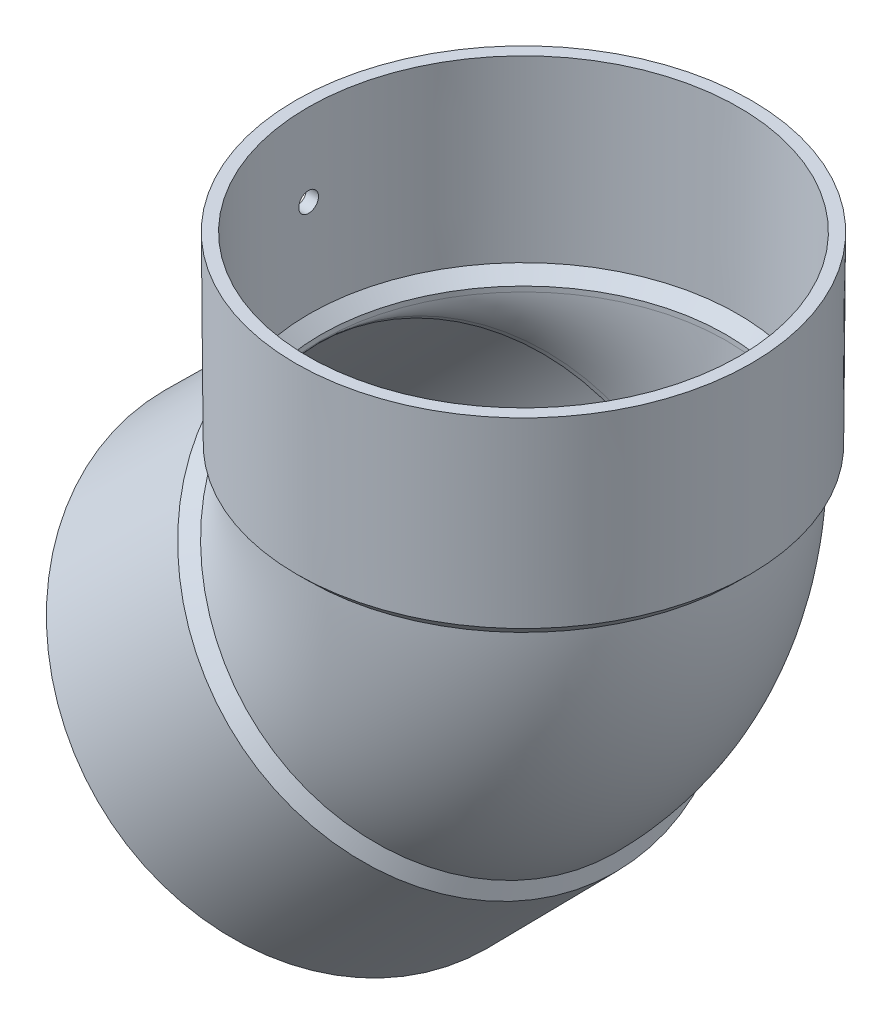
ISO-10303-21;
HEADER;
FILE_DESCRIPTION(('STEP AP214'),'2;1');
FILE_NAME('part.step','',(''),(''),'','','');
FILE_SCHEMA(('AUTOMOTIVE_DESIGN { 1 0 10303 214 1 1 1 1 }'));
ENDSEC;
DATA;
#1=APPLICATION_CONTEXT('core data for automotive mechanical design processes');
#2=APPLICATION_PROTOCOL_DEFINITION('international standard','automotive_design',2000,#1);
#3=PRODUCT_CONTEXT('',#1,'mechanical');
#4=PRODUCT('Part','Part','',(#3));
#5=PRODUCT_RELATED_PRODUCT_CATEGORY('part','',(#4));
#6=PRODUCT_DEFINITION_FORMATION('','',#4);
#7=PRODUCT_DEFINITION_CONTEXT('part definition',#1,'design');
#8=PRODUCT_DEFINITION('design','',#6,#7);
#9=PRODUCT_DEFINITION_SHAPE('','',#8);
#10=(LENGTH_UNIT() NAMED_UNIT(*) SI_UNIT(.MILLI.,.METRE.));
#11=(NAMED_UNIT(*) PLANE_ANGLE_UNIT() SI_UNIT($,.RADIAN.));
#12=(NAMED_UNIT(*) SI_UNIT($,.STERADIAN.) SOLID_ANGLE_UNIT());
#13=UNCERTAINTY_MEASURE_WITH_UNIT(LENGTH_MEASURE(1.E-05),#10,'distance_accuracy_value','');
#14=(GEOMETRIC_REPRESENTATION_CONTEXT(3) GLOBAL_UNCERTAINTY_ASSIGNED_CONTEXT((#13)) GLOBAL_UNIT_ASSIGNED_CONTEXT((#10,
#11,#12)) REPRESENTATION_CONTEXT('',''));
#15=CARTESIAN_POINT('',(0.,0.,0.));
#16=DIRECTION('',(0.,0.,1.));
#17=DIRECTION('',(1.,0.,0.));
#18=AXIS2_PLACEMENT_3D('',#15,#16,#17);
#19=CARTESIAN_POINT('',(-17.9605122421384,-17.9605122421383,0.));
#20=DIRECTION('',(-0.707106781186549,-0.707106781186546,0.));
#21=DIRECTION('',(0.707106781186546,-0.707106781186549,0.));
#22=AXIS2_PLACEMENT_3D('',#19,#20,#21);
#23=CONICAL_SURFACE('',#22,53.467,0.00714273566941352);
#24=CARTESIAN_POINT('',(-49.3914086658805,-49.3914086658802,0.));
#25=DIRECTION('',(-0.707106781186549,-0.707106781186546,0.));
#26=DIRECTION('',(0.707106781186546,-0.707106781186549,0.));
#27=AXIS2_PLACEMENT_3D('',#24,#25,#26);
#28=CIRCLE('',#27,53.7845);
#29=CARTESIAN_POINT('',(-11.3600239931527,-87.4227933386082,0.));
#30=VERTEX_POINT('',#29);
#31=EDGE_CURVE('E48',#30,#30,#28,.T.);
#32=ORIENTED_EDGE('',*,*,#31,.T.);
#33=EDGE_LOOP('',(#32));
#34=FACE_BOUND('',#33,.T.);
#35=CARTESIAN_POINT('',(-17.9605122421384,-17.9605122421383,0.));
#36=DIRECTION('',(-0.707106781186549,-0.707106781186546,0.));
#37=DIRECTION('',(0.707106781186546,-0.707106781186549,0.));
#38=AXIS2_PLACEMENT_3D('',#35,#36,#37);
#39=CIRCLE('',#38,53.467);
#40=CARTESIAN_POINT('',(19.8463660275627,-55.7673905118395,0.));
#41=VERTEX_POINT('',#40);
#42=EDGE_CURVE('E73',#41,#41,#39,.T.);
#43=ORIENTED_EDGE('',*,*,#42,.F.);
#44=EDGE_LOOP('',(#43));
#45=FACE_BOUND('',#44,.T.);
#46=ADVANCED_FACE('F36',(#34,#45),#23,.F.);
#47=CARTESIAN_POINT('',(-11.3600239931527,-87.4227933386082,0.));
#48=DIRECTION('',(-0.707106781186549,-0.707106781186546,0.));
#49=DIRECTION('',(0.707106781186546,-0.707106781186549,0.));
#50=AXIS2_PLACEMENT_3D('',#47,#48,#49);
#51=PLANE('',#50);
#52=CARTESIAN_POINT('',(-49.3914086658805,-49.3914086658802,0.));
#53=DIRECTION('',(-0.707106781186549,-0.707106781186546,0.));
#54=DIRECTION('',(0.707106781186546,-0.707106781186549,0.));
#55=AXIS2_PLACEMENT_3D('',#52,#53,#54);
#56=CIRCLE('',#55,56.8325);
#57=CARTESIAN_POINT('',(-9.20476252409606,-89.5780548076648,0.));
#58=VERTEX_POINT('',#57);
#59=EDGE_CURVE('E129',#58,#58,#56,.T.);
#60=ORIENTED_EDGE('',*,*,#59,.T.);
#61=EDGE_LOOP('',(#60));
#62=FACE_BOUND('',#61,.T.);
#63=ORIENTED_EDGE('',*,*,#31,.F.);
#64=EDGE_LOOP('',(#63));
#65=FACE_BOUND('',#64,.T.);
#66=ADVANCED_FACE('F113',(#62,#65),#51,.T.);
#67=CARTESIAN_POINT('',(-49.3914086658805,-49.3914086658802,0.));
#68=DIRECTION('',(-0.707106781186549,-0.707106781186546,0.));
#69=DIRECTION('',(0.707106781186546,-0.707106781186549,0.));
#70=AXIS2_PLACEMENT_3D('',#67,#68,#69);
#71=CONICAL_SURFACE('',#70,56.8325,0.00714273566941423);
#72=CARTESIAN_POINT('',(-17.052347567238,-17.052347567238,0.));
#73=DIRECTION('',(-0.707106781186549,-0.707106781186546,0.));
#74=DIRECTION('',(0.707106781186546,-0.707106781186549,0.));
#75=AXIS2_PLACEMENT_3D('',#72,#73,#74);
#76=CIRCLE('',#75,56.5058261514278);
#77=CARTESIAN_POINT('',(22.9033052809846,-57.0080004154608,0.));
#78=VERTEX_POINT('',#77);
#79=EDGE_CURVE('E68',#78,#78,#76,.T.);
#80=ORIENTED_EDGE('',*,*,#79,.T.);
#81=EDGE_LOOP('',(#80));
#82=FACE_BOUND('',#81,.T.);
#83=ORIENTED_EDGE('',*,*,#59,.F.);
#84=EDGE_LOOP('',(#83));
#85=FACE_BOUND('',#84,.T.);
#86=ADVANCED_FACE('F109',(#82,#85),#71,.T.);
#87=CARTESIAN_POINT('',(-17.052347567238,-17.052347567238,0.));
#88=DIRECTION('',(-0.707106781186549,-0.707106781186546,0.));
#89=DIRECTION('',(0.707106781186546,-0.707106781186549,0.));
#90=AXIS2_PLACEMENT_3D('',#87,#88,#89);
#91=CONICAL_SURFACE('',#90,56.5058261514278,0.792540899066865);
#92=CARTESIAN_POINT('',(-51.1386883010898,21.1823382562818,-15.8217340657064));
#93=CARTESIAN_POINT('',(-51.3445546272007,21.2676108805929,-15.4489949649856));
#94=CARTESIAN_POINT('',(-51.5436949504975,21.3500975033178,-15.0719492932232));
#95=CARTESIAN_POINT('',(-51.9280502774547,21.5093026925138,-14.3096032940465));
#96=CARTESIAN_POINT('',(-52.1132643970409,21.5860208927894,-13.9243024445624));
#97=CARTESIAN_POINT('',(-52.6473411481332,21.80724272644,-12.7564699303167));
#98=CARTESIAN_POINT('',(-52.9745548482119,21.9427790788068,-11.9621587611889));
#99=CARTESIAN_POINT('',(-53.5673730434156,22.1883324152817,-10.3464159460775));
#100=CARTESIAN_POINT('',(-53.8329320772154,22.2983305686923,-9.52496479490166));
#101=CARTESIAN_POINT('',(-54.2987448518667,22.4912765374795,-7.8607175087274));
#102=CARTESIAN_POINT('',(-54.4990089022301,22.5742286231958,-7.01792476604918));
#103=CARTESIAN_POINT('',(-54.8320226243953,22.712167423373,-5.31430067565922));
#104=CARTESIAN_POINT('',(-54.9645772133616,22.7670733318776,-4.45342456318949));
#105=CARTESIAN_POINT('',(-55.1594165840135,22.8477784416859,-2.72232884088088));
#106=CARTESIAN_POINT('',(-55.221697054823,22.8735758573662,-1.85210866114739));
#107=CARTESIAN_POINT('',(-55.2750358958326,22.8956695287136,-0.109853699101001));
#108=CARTESIAN_POINT('',(-55.2661547990616,22.8919908579823,0.762178910247794));
#109=CARTESIAN_POINT('',(-55.1774455467202,22.8552462825545,2.50194309130272));
#110=CARTESIAN_POINT('',(-55.0976225655384,22.82218252116,3.36967497205551));
#111=CARTESIAN_POINT('',(-54.8728461092849,22.7290770644776,5.0593901401351));
#112=CARTESIAN_POINT('',(-54.7306521782881,22.6701784097716,5.88180607745796));
#113=CARTESIAN_POINT('',(-54.3838691909492,22.5265361932156,7.51108394082089));
#114=CARTESIAN_POINT('',(-54.1792786280365,22.4417920073236,8.31794549079915));
#115=CARTESIAN_POINT('',(-53.7104164511496,22.2475829347733,9.91045826162869));
#116=CARTESIAN_POINT('',(-53.4461825757334,22.1381336799374,10.6961225443826));
#117=CARTESIAN_POINT('',(-52.8611316775628,21.8957976632366,12.242023682349));
#118=CARTESIAN_POINT('',(-52.5403392166478,21.7629210752186,13.0022714054723));
#119=CARTESIAN_POINT('',(-52.0287734663886,21.5510236034157,14.1005570731325));
#120=CARTESIAN_POINT('',(-51.8585573378671,21.4805177744474,14.4499860689717));
#121=CARTESIAN_POINT('',(-51.5069574838201,21.3348803463727,15.1413621640509));
#122=CARTESIAN_POINT('',(-51.3255948841588,21.2597574978858,15.4833218475854));
#123=CARTESIAN_POINT('',(-51.1386883010898,21.1823382562818,15.8217340657064));
#124=B_SPLINE_CURVE_WITH_KNOTS('',3,(#92,#93,#94,#95,#96,#97,#98,#99,#100,#101,#102,#103,#104,
#105,#106,#107,#108,#109,#110,#111,#112,#113,#114,#115,#116,#117,#118,#119,#120,#121,#122,#123),
.UNSPECIFIED.,.F.,.F.,(4,2,2,2,2,2,2,2,2,2,2,2,2,2,2,4),(0.,1.30263064434059,2.60534391359455,
5.21129520286088,7.8191619414704,10.4266167208971,13.0415422504997,15.6566281806555,
18.269489844798,20.8821609465945,23.3893535670762,25.8966067286685,28.4022778823317,
30.9068635601488,32.0917264457681,33.2744090629202),.UNSPECIFIED.);
#125=CARTESIAN_POINT('',(-51.1391711438023,21.1825382562818,-15.8208598051719));
#126=VERTEX_POINT('',#125);
#127=CARTESIAN_POINT('',(-51.1391711438023,21.1825382562819,15.8208598051716));
#128=VERTEX_POINT('',#127);
#129=EDGE_CURVE('E67',#126,#128,#124,.T.);
#130=ORIENTED_EDGE('',*,*,#129,.F.);
#131=CARTESIAN_POINT('',(-14.9783164437603,-14.9783164437603,0.));
#132=DIRECTION('',(-0.707106781186549,-0.707106781186546,0.));
#133=DIRECTION('',(0.707106781186546,-0.707106781186549,0.));
#134=AXIS2_PLACEMENT_3D('',#131,#132,#133);
#135=CIRCLE('',#134,53.5305);
#136=EDGE_CURVE('E54',#126,#128,#135,.T.);
#137=ORIENTED_EDGE('',*,*,#136,.T.);
#138=EDGE_LOOP('',(#130,#137));
#139=FACE_BOUND('',#138,.T.);
#140=ORIENTED_EDGE('',*,*,#79,.F.);
#141=EDGE_LOOP('',(#140));
#142=FACE_BOUND('',#141,.T.);
#143=ADVANCED_FACE('F65',(#139,#142),#91,.T.);
#144=CARTESIAN_POINT('',(-49.3914086658805,-49.3914086658802,0.));
#145=DIRECTION('',(-0.707106781186549,-0.707106781186546,0.));
#146=DIRECTION('',(0.707106781186546,-0.707106781186549,0.));
#147=AXIS2_PLACEMENT_3D('',#144,#145,#146);
#148=CYLINDRICAL_SURFACE('',#147,50.4825);
#149=CARTESIAN_POINT('',(-15.8800862407573,-15.8800862407572,0.));
#150=DIRECTION('',(-0.707106781186549,-0.707106781186546,0.));
#151=DIRECTION('',(0.707106781186546,-0.707106781186549,0.));
#152=AXIS2_PLACEMENT_3D('',#149,#150,#151);
#153=CIRCLE('',#152,50.4825);
#154=CARTESIAN_POINT('',(19.8164318404925,-51.5766043220072,0.));
#155=VERTEX_POINT('',#154);
#156=EDGE_CURVE('E76',#155,#155,#153,.T.);
#157=ORIENTED_EDGE('',*,*,#156,.T.);
#158=EDGE_LOOP('',(#157));
#159=FACE_BOUND('',#158,.T.);
#160=CARTESIAN_POINT('',(-14.9783164437603,-14.9783164437603,0.));
#161=DIRECTION('',(-0.707106781186549,-0.707106781186546,0.));
#162=DIRECTION('',(0.707106781186546,-0.707106781186549,0.));
#163=AXIS2_PLACEMENT_3D('',#160,#161,#162);
#164=CIRCLE('',#163,50.4825);
#165=CARTESIAN_POINT('',(20.7182016374896,-50.6748345250102,0.));
#166=VERTEX_POINT('',#165);
#167=EDGE_CURVE('E69',#166,#166,#164,.T.);
#168=ORIENTED_EDGE('',*,*,#167,.F.);
#169=EDGE_LOOP('',(#168));
#170=FACE_BOUND('',#169,.T.);
#171=ADVANCED_FACE('F102',(#159,#170),#148,.F.);
#172=CARTESIAN_POINT('',(-15.8800862407573,-15.8800862407572,0.));
#173=DIRECTION('',(-0.707106781186549,-0.707106781186546,0.));
#174=DIRECTION('',(0.707106781186546,-0.707106781186549,0.));
#175=AXIS2_PLACEMENT_3D('',#172,#173,#174);
#176=CONICAL_SURFACE('',#175,50.4825,0.792540899066863);
#177=ORIENTED_EDGE('',*,*,#42,.T.);
#178=EDGE_LOOP('',(#177));
#179=FACE_BOUND('',#178,.T.);
#180=ORIENTED_EDGE('',*,*,#156,.F.);
#181=EDGE_LOOP('',(#180));
#182=FACE_BOUND('',#181,.T.);
#183=ADVANCED_FACE('F99',(#179,#182),#176,.F.);
#184=CARTESIAN_POINT('',(0.,69.85,0.));
#185=DIRECTION('',(0.,1.,0.));
#186=DIRECTION('',(-1.,0.,0.));
#187=AXIS2_PLACEMENT_3D('',#184,#185,#186);
#188=CONICAL_SURFACE('',#187,56.8325,0.00714273566941378);
#189=CARTESIAN_POINT('',(-56.6467824057987,47.7845815504368,-1.7847085601479));
#190=CARTESIAN_POINT('',(-56.6490552447484,47.6843269427053,-1.68982056537799));
#191=CARTESIAN_POINT('',(-56.65141459413,47.5920130347859,-1.58640103364113));
#192=CARTESIAN_POINT('',(-56.6559845212046,47.425981401465,-1.36544410977227));
#193=CARTESIAN_POINT('',(-56.6581949194383,47.3522858241184,-1.24789014650958));
#194=CARTESIAN_POINT('',(-56.6621700985952,47.2257058139968,-1.00211028745787));
#195=CARTESIAN_POINT('',(-56.6639350748892,47.172812251345,-0.873889103450648));
#196=CARTESIAN_POINT('',(-56.6667891576251,47.0893232371185,-0.610412540608665));
#197=CARTESIAN_POINT('',(-56.6678784323732,47.0587222325014,-0.475158922542481));
#198=CARTESIAN_POINT('',(-56.6692402436884,47.0206772056656,-0.201495659368974));
#199=CARTESIAN_POINT('',(-56.6695131790771,47.0132218755888,-0.0630875886796641));
#200=CARTESIAN_POINT('',(-56.6692081685265,47.0216506593449,0.213019993559686));
#201=CARTESIAN_POINT('',(-56.6686301920366,47.0375356111736,0.350719479490991));
#202=CARTESIAN_POINT('',(-56.666698501141,47.0921784405294,0.621426222374573));
#203=CARTESIAN_POINT('',(-56.6653451668095,47.1309251117043,0.754435744422956));
#204=CARTESIAN_POINT('',(-56.6620386787357,47.230177729406,1.01206377905149));
#205=CARTESIAN_POINT('',(-56.6600855238583,47.2906837171151,1.13668227575002));
#206=CARTESIAN_POINT('',(-56.6558342424687,47.4317760543097,1.37407029529862));
#207=CARTESIAN_POINT('',(-56.6535359184062,47.5123739204974,1.48683296948055));
#208=CARTESIAN_POINT('',(-56.6489023474887,47.6913459843571,1.69723680528968));
#209=CARTESIAN_POINT('',(-56.646567100517,47.7897202382455,1.79487791909436));
#210=CARTESIAN_POINT('',(-56.6421802382424,48.00153635572,1.97233954058257));
#211=CARTESIAN_POINT('',(-56.6401288297208,48.1149890875018,2.05214708195457));
#212=CARTESIAN_POINT('',(-56.636611578472,48.3536902259841,2.19158488638207));
#213=CARTESIAN_POINT('',(-56.6351457352904,48.4789386235343,2.25121516508979));
#214=CARTESIAN_POINT('',(-56.633041107137,48.7376432876308,2.34858817304739));
#215=CARTESIAN_POINT('',(-56.6324021118536,48.8710974579594,2.38633646670947));
#216=CARTESIAN_POINT('',(-56.6321033513651,49.1424499347563,2.43889121910963));
#217=CARTESIAN_POINT('',(-56.6324435801542,49.2803482139619,2.45369781855787));
#218=CARTESIAN_POINT('',(-56.6341473792817,49.5565507753689,2.45994352829959));
#219=CARTESIAN_POINT('',(-56.6355100931667,49.6948546213386,2.45140217947447));
#220=CARTESIAN_POINT('',(-56.6391873782976,49.9680558768862,2.4112378351702));
#221=CARTESIAN_POINT('',(-56.6415019490193,50.10295328834,2.37961485240223));
#222=CARTESIAN_POINT('',(-56.6469027455079,50.3655004517315,2.2941939414815));
#223=CARTESIAN_POINT('',(-56.6499888843921,50.4931510177181,2.24039850962305));
#224=CARTESIAN_POINT('',(-56.6566620301151,50.7376084140601,2.11216217275519));
#225=CARTESIAN_POINT('',(-56.6602490396292,50.8544151864909,2.03772115747114));
#226=CARTESIAN_POINT('',(-56.6675933748424,51.0739699613711,1.87023746604726));
#227=CARTESIAN_POINT('',(-56.6713508323801,51.1767068253715,1.77718019410513));
#228=CARTESIAN_POINT('',(-56.67867214119,51.3651061217943,1.57513677348755));
#229=CARTESIAN_POINT('',(-56.6822359918568,51.4507685008304,1.46615057500953));
#230=CARTESIAN_POINT('',(-56.6888219345178,51.6026268482954,1.23528156212708));
#231=CARTESIAN_POINT('',(-56.6918437772565,51.6688138694252,1.11339285495495));
#232=CARTESIAN_POINT('',(-56.6970429465168,51.7797867483016,0.860217362347077));
#233=CARTESIAN_POINT('',(-56.6992202765743,51.8245726956522,0.72893061626264));
#234=CARTESIAN_POINT('',(-56.7025109090861,51.891447296252,0.460766843932593));
#235=CARTESIAN_POINT('',(-56.7036248323158,51.913549192132,0.323893127867901));
#236=CARTESIAN_POINT('',(-56.7046786085942,51.9344707638727,0.0483735110589271));
#237=CARTESIAN_POINT('',(-56.7046184668645,51.9332905432824,-0.0902723818007285));
#238=CARTESIAN_POINT('',(-56.7033306656041,51.9076910994935,-0.365295840313714));
#239=CARTESIAN_POINT('',(-56.7021038399306,51.8832884739004,-0.501674955259582));
#240=CARTESIAN_POINT('',(-56.6986072989083,51.8119639272732,-0.768397208214286));
#241=CARTESIAN_POINT('',(-56.6963375826646,51.7650419869135,-0.898740341043071));
#242=CARTESIAN_POINT('',(-56.6909816360816,51.6499973163137,-1.14973176279636));
#243=CARTESIAN_POINT('',(-56.6878951869726,51.5818689048544,-1.27037744286009));
#244=CARTESIAN_POINT('',(-56.6812122250419,51.4263470904105,-1.49852180179451));
#245=CARTESIAN_POINT('',(-56.6776157084149,51.3389535437024,-1.60602038257466));
#246=CARTESIAN_POINT('',(-56.6702614497254,51.1472939918908,-1.80491284104964));
#247=CARTESIAN_POINT('',(-56.6665035760811,51.0430140167505,-1.896293252376));
#248=CARTESIAN_POINT('',(-56.6591900282072,50.8205852444693,-2.06024912628291));
#249=CARTESIAN_POINT('',(-56.6556343544962,50.7024364117632,-2.13282454063853));
#250=CARTESIAN_POINT('',(-56.6490546641157,50.4556018741559,-2.25711560789211));
#251=CARTESIAN_POINT('',(-56.646030710141,50.3269149293302,-2.30882880186624));
#252=CARTESIAN_POINT('',(-56.6407790501589,50.062673454162,-2.38990686162789));
#253=CARTESIAN_POINT('',(-56.6385513091787,49.9271192257571,-2.41927270906545));
#254=CARTESIAN_POINT('',(-56.6350634854664,49.653115582457,-2.45480535632855));
#255=CARTESIAN_POINT('',(-56.6338025394981,49.5146688639709,-2.46099287095435));
#256=CARTESIAN_POINT('',(-56.6323038154692,49.2386583093064,-2.45004532404195));
#257=CARTESIAN_POINT('',(-56.6320662838949,49.1010946937859,-2.43290464528554));
#258=CARTESIAN_POINT('',(-56.6325585486263,48.8308046922703,-2.37579064006177));
#259=CARTESIAN_POINT('',(-56.6332883652966,48.6980784081707,-2.33581683292449));
#260=CARTESIAN_POINT('',(-56.6355526728271,48.4413319776584,-2.23419588430897));
#261=CARTESIAN_POINT('',(-56.6370862162292,48.317301774805,-2.17257429005233));
#262=CARTESIAN_POINT('',(-56.6400395751938,48.1248849443704,-2.05587274051497));
#263=CARTESIAN_POINT('',(-56.6412934426922,48.0528224089728,-2.00673514444769));
#264=CARTESIAN_POINT('',(-56.6439475186957,47.9143124445576,-1.90110101360461));
#265=CARTESIAN_POINT('',(-56.6453477272846,47.8478650187499,-1.84460447462204));
#266=CARTESIAN_POINT('',(-56.6467824057987,47.7845815504368,-1.7847085601479));
#267=B_SPLINE_CURVE_WITH_KNOTS('',3,(#189,#190,#191,#192,#193,#194,#195,#196,#197,#198,#199,
#200,#201,#202,#203,#204,#205,#206,#207,#208,#209,#210,#211,#212,#213,#214,#215,#216,#217,#218,
#219,#220,#221,#222,#223,#224,#225,#226,#227,#228,#229,#230,#231,#232,#233,#234,#235,#236,#237,
#238,#239,#240,#241,#242,#243,#244,#245,#246,#247,#248,#249,#250,#251,#252,#253,#254,#255,#256,
#257,#258,#259,#260,#261,#262,#263,#264,#265,#266),.UNSPECIFIED.,.T.,.F.,(4,2,2,2,2,2,2,2,2,2,2,
2,2,2,2,2,2,2,2,2,2,2,2,2,2,2,2,2,2,2,2,2,2,2,2,2,2,2,4),(0.,0.413854932145331,
0.828199885334089,1.24236278157126,1.65642247514744,2.07027984730669,2.48415207871987,
2.89782160668287,3.31149191757268,3.72539989248412,4.13930917636921,4.55351843040822,
4.96772736312971,5.38183091960439,5.79593193621407,6.20968648037835,6.62344079668627,
7.03714854301313,7.45085849912769,7.86489409873099,8.27893099286501,8.69315780641137,
9.10738288561558,9.52136600824822,9.93534728966088,10.3490329108471,10.7627188870497,
11.1765157853577,11.5903157708176,12.0044598559756,12.418605003185,12.8327989493255,
13.2469747001525,13.6607802078852,14.0746853738761,14.488599253482,14.9020262924483,
15.1632627693095,15.4244993955084),.UNSPECIFIED.);
#268=CARTESIAN_POINT('',(-56.6467824057987,47.7845815504368,-1.7847085601479));
#269=VERTEX_POINT('',#268);
#270=EDGE_CURVE('E11',#269,#269,#267,.T.);
#271=ORIENTED_EDGE('',*,*,#270,.F.);
#272=EDGE_LOOP('',(#271));
#273=FACE_BOUND('',#272,.T.);
#274=CARTESIAN_POINT('',(0.,24.1156611998879,0.));
#275=DIRECTION('',(0.,1.,0.));
#276=DIRECTION('',(-1.,0.,0.));
#277=AXIS2_PLACEMENT_3D('',#274,#275,#276);
#278=CIRCLE('',#277,56.5058261514278);
#279=CARTESIAN_POINT('',(-56.5058261514278,24.1156611998879,0.));
#280=VERTEX_POINT('',#279);
#281=EDGE_CURVE('E61',#280,#280,#278,.T.);
#282=ORIENTED_EDGE('',*,*,#281,.T.);
#283=EDGE_LOOP('',(#282));
#284=FACE_BOUND('',#283,.T.);
#285=CARTESIAN_POINT('',(0.,69.85,0.));
#286=DIRECTION('',(0.,1.,0.));
#287=DIRECTION('',(-1.,0.,0.));
#288=AXIS2_PLACEMENT_3D('',#285,#286,#287);
#289=CIRCLE('',#288,56.8325);
#290=CARTESIAN_POINT('',(-56.8325,69.8500000000001,0.));
#291=VERTEX_POINT('',#290);
#292=EDGE_CURVE('E148',#291,#291,#289,.T.);
#293=ORIENTED_EDGE('',*,*,#292,.F.);
#294=EDGE_LOOP('',(#293));
#295=FACE_BOUND('',#294,.T.);
#296=ADVANCED_FACE('F94',(#273,#284,#295),#188,.T.);
#297=CARTESIAN_POINT('',(0.,24.1156611998879,0.));
#298=DIRECTION('',(0.,1.,0.));
#299=DIRECTION('',(-1.,0.,0.));
#300=AXIS2_PLACEMENT_3D('',#297,#298,#299);
#301=CONICAL_SURFACE('',#300,56.5058261514278,0.792540899066866);
#302=CARTESIAN_POINT('',(0.,21.1825382562818,0.));
#303=DIRECTION('',(0.,1.,0.));
#304=DIRECTION('',(-1.,0.,0.));
#305=AXIS2_PLACEMENT_3D('',#302,#303,#304);
#306=CIRCLE('',#305,53.5305);
#307=EDGE_CURVE('E57',#128,#126,#306,.T.);
#308=ORIENTED_EDGE('',*,*,#307,.T.);
#309=ORIENTED_EDGE('',*,*,#129,.T.);
#310=EDGE_LOOP('',(#308,#309));
#311=FACE_BOUND('',#310,.T.);
#312=ORIENTED_EDGE('',*,*,#281,.F.);
#313=EDGE_LOOP('',(#312));
#314=FACE_BOUND('',#313,.T.);
#315=ADVANCED_FACE('F71',(#311,#314),#301,.T.);
#316=CARTESIAN_POINT('',(0.,69.85,0.));
#317=DIRECTION('',(0.,1.,0.));
#318=DIRECTION('',(-1.,0.,0.));
#319=AXIS2_PLACEMENT_3D('',#316,#317,#318);
#320=CYLINDRICAL_SURFACE('',#319,50.4825);
#321=CARTESIAN_POINT('',(0.,22.4578333333334,0.));
#322=DIRECTION('',(0.,1.,0.));
#323=DIRECTION('',(-1.,0.,0.));
#324=AXIS2_PLACEMENT_3D('',#321,#322,#323);
#325=CIRCLE('',#324,50.4825);
#326=CARTESIAN_POINT('',(-50.4825,22.4578333333334,0.));
#327=VERTEX_POINT('',#326);
#328=EDGE_CURVE('E134',#327,#327,#325,.T.);
#329=ORIENTED_EDGE('',*,*,#328,.T.);
#330=EDGE_LOOP('',(#329));
#331=FACE_BOUND('',#330,.T.);
#332=CARTESIAN_POINT('',(0.,21.1825382562818,0.));
#333=DIRECTION('',(0.,1.,0.));
#334=DIRECTION('',(-1.,0.,0.));
#335=AXIS2_PLACEMENT_3D('',#332,#333,#334);
#336=CIRCLE('',#335,50.4825);
#337=CARTESIAN_POINT('',(50.4825,21.1825382562818,0.));
#338=VERTEX_POINT('',#337);
#339=EDGE_CURVE('E62',#338,#338,#336,.T.);
#340=ORIENTED_EDGE('',*,*,#339,.F.);
#341=EDGE_LOOP('',(#340));
#342=FACE_BOUND('',#341,.T.);
#343=ADVANCED_FACE('F93',(#331,#342),#320,.F.);
#344=CARTESIAN_POINT('',(0.,22.4578333333334,0.));
#345=DIRECTION('',(0.,1.,0.));
#346=DIRECTION('',(-1.,0.,0.));
#347=AXIS2_PLACEMENT_3D('',#344,#345,#346);
#348=CONICAL_SURFACE('',#347,50.4825,0.792540899066866);
#349=CARTESIAN_POINT('',(0.,25.4,0.));
#350=DIRECTION('',(0.,1.,0.));
#351=DIRECTION('',(-1.,0.,0.));
#352=AXIS2_PLACEMENT_3D('',#349,#350,#351);
#353=CIRCLE('',#352,53.467);
#354=CARTESIAN_POINT('',(-53.467,25.4,0.));
#355=VERTEX_POINT('',#354);
#356=EDGE_CURVE('E138',#355,#355,#353,.T.);
#357=ORIENTED_EDGE('',*,*,#356,.T.);
#358=EDGE_LOOP('',(#357));
#359=FACE_BOUND('',#358,.T.);
#360=ORIENTED_EDGE('',*,*,#328,.F.);
#361=EDGE_LOOP('',(#360));
#362=FACE_BOUND('',#361,.T.);
#363=ADVANCED_FACE('F176',(#359,#362),#348,.F.);
#364=CARTESIAN_POINT('',(0.,25.4,0.));
#365=DIRECTION('',(0.,1.,0.));
#366=DIRECTION('',(-1.,0.,0.));
#367=AXIS2_PLACEMENT_3D('',#364,#365,#366);
#368=CONICAL_SURFACE('',#367,53.467,0.00714273566941367);
#369=CARTESIAN_POINT('',(-53.5976422832507,47.7940020786178,-1.77292855777233));
#370=CARTESIAN_POINT('',(-53.5951930132879,47.8935928880364,-1.86849067844678));
#371=CARTESIAN_POINT('',(-53.5928216385807,48.0013231776564,-1.95571452704544));
#372=CARTESIAN_POINT('',(-53.5885682427633,48.2299906474478,-2.11091782551891));
#373=CARTESIAN_POINT('',(-53.5866868020674,48.350943253245,-2.17887445831852));
#374=CARTESIAN_POINT('',(-53.5837020673159,48.6025074159901,-2.29349808322846));
#375=CARTESIAN_POINT('',(-53.5825984379868,48.7331147844212,-2.34017424516256));
#376=CARTESIAN_POINT('',(-53.5813721103662,49.0002809900587,-2.41092599879209));
#377=CARTESIAN_POINT('',(-53.5812491681504,49.136838338842,-2.43500720916774));
#378=CARTESIAN_POINT('',(-53.5820796612305,49.4119745926964,-2.45989677592477));
#379=CARTESIAN_POINT('',(-53.5830324666172,49.5505522678758,-2.46071874452193));
#380=CARTESIAN_POINT('',(-53.5859894817726,49.8258744466268,-2.43909954840645));
#381=CARTESIAN_POINT('',(-53.5879937299394,49.9626188830626,-2.41665753407729));
#382=CARTESIAN_POINT('',(-53.5929087841509,50.2303349013773,-2.34916373297437));
#383=CARTESIAN_POINT('',(-53.5958192382317,50.3613087020239,-2.30412072011834));
#384=CARTESIAN_POINT('',(-53.6022977149043,50.6138317090806,-2.19271171497211));
#385=CARTESIAN_POINT('',(-53.6058657395738,50.7353808857069,-2.1263456553001));
#386=CARTESIAN_POINT('',(-53.6133336755204,50.9657074193176,-1.97411522185412));
#387=CARTESIAN_POINT('',(-53.6172338375939,51.074474974763,-1.88823603064309));
#388=CARTESIAN_POINT('',(-53.6249900245575,51.2760556989752,-1.69944082167385));
#389=CARTESIAN_POINT('',(-53.6288460493149,51.3688688197954,-1.59652475271785));
#390=CARTESIAN_POINT('',(-53.6361384686572,51.5359737859855,-1.37648965362513));
#391=CARTESIAN_POINT('',(-53.6395745659668,51.6102525488123,-1.25936067744542));
#392=CARTESIAN_POINT('',(-53.6456814865031,51.7380940429199,-1.01427726996573));
#393=CARTESIAN_POINT('',(-53.6483523113483,51.7916568180158,-0.886322861562589));
#394=CARTESIAN_POINT('',(-53.6526588640339,51.87652145206,-0.623279967185373));
#395=CARTESIAN_POINT('',(-53.6542950564656,51.9078333033492,-0.488194712814636));
#396=CARTESIAN_POINT('',(-53.6563686400757,51.9473409559833,-0.214676500466816));
#397=CARTESIAN_POINT('',(-53.6568060390825,51.9555369082834,-0.0762435643572487));
#398=CARTESIAN_POINT('',(-53.656437842644,51.9485819754149,0.199907757070099));
#399=CARTESIAN_POINT('',(-53.6556333646219,51.9334520785315,0.337626673009178));
#400=CARTESIAN_POINT('',(-53.6528649639106,51.8803163023143,0.608565977553761));
#401=CARTESIAN_POINT('',(-53.6509010405665,51.8423104100622,0.741786363618837));
#402=CARTESIAN_POINT('',(-53.6460117303948,51.7445024294463,0.999958452666929));
#403=CARTESIAN_POINT('',(-53.6430862933897,51.6846992035523,1.12490972371019));
#404=CARTESIAN_POINT('',(-53.6365669642918,51.5449942846336,1.36300090431828));
#405=CARTESIAN_POINT('',(-53.632973068016,51.4650924658412,1.47614073996634));
#406=CARTESIAN_POINT('',(-53.6254692550892,51.2873692031784,1.68750878687419));
#407=CARTESIAN_POINT('',(-53.6215590499746,51.1895312968385,1.78572314620761));
#408=CARTESIAN_POINT('',(-53.6138069314171,50.9787535262377,1.96433365342816));
#409=CARTESIAN_POINT('',(-53.60996501814,50.8658136253306,2.04472975807654));
#410=CARTESIAN_POINT('',(-53.6027131727741,50.6279850246598,2.18544774730989));
#411=CARTESIAN_POINT('',(-53.5993033949909,50.5030920845256,2.24576247373707));
#412=CARTESIAN_POINT('',(-53.5932271954895,50.2449335236916,2.34455980503197));
#413=CARTESIAN_POINT('',(-53.5905607697124,50.1116679487122,2.38304252910628));
#414=CARTESIAN_POINT('',(-53.5861940052047,49.8406549877214,2.43705576577488));
#415=CARTESIAN_POINT('',(-53.5844929263566,49.7029111210551,2.45260387667329));
#416=CARTESIAN_POINT('',(-53.5821628309982,49.4267591523073,2.46035920576858));
#417=CARTESIAN_POINT('',(-53.5815338098942,49.2883510530745,2.45256652397901));
#418=CARTESIAN_POINT('',(-53.5813354057284,49.0149005893922,2.41387699121551));
#419=CARTESIAN_POINT('',(-53.5817652879062,48.8798559567603,2.38299617118492));
#420=CARTESIAN_POINT('',(-53.5835531857397,48.6168626651376,2.29902991684316));
#421=CARTESIAN_POINT('',(-53.584911203439,48.4889140217721,2.24594443363973));
#422=CARTESIAN_POINT('',(-53.5883260115142,48.2436788568578,2.11904870571713));
#423=CARTESIAN_POINT('',(-53.5903831252886,48.1263973017409,2.04522887213118));
#424=CARTESIAN_POINT('',(-53.5948935764251,47.905881329945,1.87896802005129));
#425=CARTESIAN_POINT('',(-53.5973469169073,47.8026470238966,1.78652685491716));
#426=CARTESIAN_POINT('',(-53.6023137823552,47.6130619798295,1.58554861843693));
#427=CARTESIAN_POINT('',(-53.6048273592665,47.5267264492731,1.47699720225868));
#428=CARTESIAN_POINT('',(-53.6095772393701,47.3735053984076,1.24693429246031));
#429=CARTESIAN_POINT('',(-53.6118135421773,47.3066199051246,1.12542278083219));
#430=CARTESIAN_POINT('',(-53.615716347008,47.1942060946415,0.872890784285387));
#431=CARTESIAN_POINT('',(-53.6173828777742,47.1486767000742,0.74187077943392));
#432=CARTESIAN_POINT('',(-53.619930790298,47.0802727157969,0.474042647330108));
#433=CARTESIAN_POINT('',(-53.6208122071799,47.0573971126019,0.337234779300626));
#434=CARTESIAN_POINT('',(-53.6216763381043,47.0349631502378,0.0618604510435984));
#435=CARTESIAN_POINT('',(-53.6216599759347,47.0353808229883,-0.0767040548349213));
#436=CARTESIAN_POINT('',(-53.6207327438996,47.0594677509446,-0.351831004815699));
#437=CARTESIAN_POINT('',(-53.6198216584614,47.0831426096831,-0.488392958379742));
#438=CARTESIAN_POINT('',(-53.6172217550655,47.1530683425642,-0.755605934438717));
#439=CARTESIAN_POINT('',(-53.615532836899,47.1993221256118,-0.886256192943277));
#440=CARTESIAN_POINT('',(-53.61159632585,47.3130631006058,-1.13782497192448));
#441=CARTESIAN_POINT('',(-53.6093493901062,47.3805253414912,-1.25875471941007));
#442=CARTESIAN_POINT('',(-53.6054663300389,47.5063497699598,-1.44548354201997));
#443=CARTESIAN_POINT('',(-53.6039086765719,47.5589652117772,-1.51522763089064));
#444=CARTESIAN_POINT('',(-53.6007710603499,47.6713028635851,-1.64873542752908));
#445=CARTESIAN_POINT('',(-53.5991910975765,47.731025079477,-1.71249913033065));
#446=CARTESIAN_POINT('',(-53.5976422832507,47.7940020786178,-1.77292855777233));
#447=B_SPLINE_CURVE_WITH_KNOTS('',3,(#369,#370,#371,#372,#373,#374,#375,#376,#377,#378,#379,
#380,#381,#382,#383,#384,#385,#386,#387,#388,#389,#390,#391,#392,#393,#394,#395,#396,#397,#398,
#399,#400,#401,#402,#403,#404,#405,#406,#407,#408,#409,#410,#411,#412,#413,#414,#415,#416,#417,
#418,#419,#420,#421,#422,#423,#424,#425,#426,#427,#428,#429,#430,#431,#432,#433,#434,#435,#436,
#437,#438,#439,#440,#441,#442,#443,#444,#445,#446),.UNSPECIFIED.,.T.,.F.,(4,2,2,2,2,2,2,2,2,2,2,
2,2,2,2,2,2,2,2,2,2,2,2,2,2,2,2,2,2,2,2,2,2,2,2,2,2,2,4),(0.,0.413817153461301,
0.828122339562137,1.24224883109415,1.65627231459451,2.0700534903842,2.4838497782769,
2.89748555074466,3.31112263033344,3.72507486420341,4.13902834207024,4.55327318915712,
4.96751716009827,5.3815749865334,5.79563010901647,6.209312887654,6.62299589990436,
7.03670050398532,7.45040769690315,7.8644965256822,8.27858635930096,8.69282364070788,
9.10705866028408,9.52097566129176,9.93489088869865,10.3485189861354,10.7621479943413,
11.1759686064461,11.5897924774534,12.0039870596641,12.4181822174041,12.8323564776825,
13.2465122078039,13.6602417920047,14.0740710837077,14.4879537042509,14.9013512161128,
15.1630313955284,15.4247117922455),.UNSPECIFIED.);
#448=CARTESIAN_POINT('',(-53.5976422832507,47.7940020786178,-1.77292855777233));
#449=VERTEX_POINT('',#448);
#450=EDGE_CURVE('E151',#449,#449,#447,.T.);
#451=ORIENTED_EDGE('',*,*,#450,.F.);
#452=EDGE_LOOP('',(#451));
#453=FACE_BOUND('',#452,.T.);
#454=CARTESIAN_POINT('',(0.,69.85,0.));
#455=DIRECTION('',(0.,1.,0.));
#456=DIRECTION('',(-1.,0.,0.));
#457=AXIS2_PLACEMENT_3D('',#454,#455,#456);
#458=CIRCLE('',#457,53.7845);
#459=CARTESIAN_POINT('',(-53.7845,69.8500000000001,0.));
#460=VERTEX_POINT('',#459);
#461=EDGE_CURVE('E143',#460,#460,#458,.T.);
#462=ORIENTED_EDGE('',*,*,#461,.T.);
#463=EDGE_LOOP('',(#462));
#464=FACE_BOUND('',#463,.T.);
#465=ORIENTED_EDGE('',*,*,#356,.F.);
#466=EDGE_LOOP('',(#465));
#467=FACE_BOUND('',#466,.T.);
#468=ADVANCED_FACE('F157',(#453,#464,#467),#368,.F.);
#469=CARTESIAN_POINT('',(53.7845,69.85,0.));
#470=DIRECTION('',(0.,1.,0.));
#471=DIRECTION('',(-1.,0.,0.));
#472=AXIS2_PLACEMENT_3D('',#469,#470,#471);
#473=PLANE('',#472);
#474=ORIENTED_EDGE('',*,*,#292,.T.);
#475=EDGE_LOOP('',(#474));
#476=FACE_BOUND('',#475,.T.);
#477=ORIENTED_EDGE('',*,*,#461,.F.);
#478=EDGE_LOOP('',(#477));
#479=FACE_BOUND('',#478,.T.);
#480=ADVANCED_FACE('F170',(#476,#479),#473,.T.);
#481=CARTESIAN_POINT('',(-102.278342287605,21.1825382562818,0.));
#482=DIRECTION('',(0.,-1.,0.));
#483=DIRECTION('',(-1.,0.,0.));
#484=AXIS2_PLACEMENT_3D('',#481,#482,#483);
#485=CIRCLE('',#484,53.5305);
#486=TRIMMED_CURVE('',#485,(PARAMETER_VALUE(-2.8415630212061)),
(PARAMETER_VALUE(2.8415630212061)),.T.,.PARAMETER.);
#487=CARTESIAN_POINT('',(-51.1391711438024,21.1825382562818,0.));
#488=DIRECTION('',(0.,0.,-1.));
#489=AXIS1_PLACEMENT('',#487,#488);
#490=SURFACE_OF_REVOLUTION('',#486,#489);
#491=ORIENTED_EDGE('',*,*,#136,.F.);
#492=ORIENTED_EDGE('',*,*,#307,.F.);
#493=EDGE_LOOP('',(#491,#492));
#494=FACE_BOUND('',#493,.T.);
#495=ADVANCED_FACE('F58',(#494),#490,.T.);
#496=CARTESIAN_POINT('',(-51.1391711438024,21.1825382562818,0.));
#497=DIRECTION('',(0.,0.,-1.));
#498=DIRECTION('',(-1.,0.,0.));
#499=AXIS2_PLACEMENT_3D('',#496,#497,#498);
#500=TOROIDAL_SURFACE('',#499,51.1391711438024,50.4825);
#501=CARTESIAN_POINT('',(-51.1391711438024,21.1825382562818,0.));
#502=DIRECTION('',(0.,0.,-1.));
#503=DIRECTION('',(-1.,0.,0.));
#504=AXIS2_PLACEMENT_3D('',#501,#502,#503);
#505=CIRCLE('',#504,101.621671143802);
#506=EDGE_CURVE('',#338,#166,#505,.T.);
#507=ORIENTED_EDGE('',*,*,#339,.T.);
#508=ORIENTED_EDGE('',*,*,#167,.T.);
#509=ORIENTED_EDGE('',*,*,#506,.T.);
#510=ORIENTED_EDGE('',*,*,#506,.F.);
#511=EDGE_LOOP('',(#507,#509,#508,#510));
#512=FACE_BOUND('',#511,.T.);
#513=ADVANCED_FACE('F164',(#512),#500,.F.);
#514=CARTESIAN_POINT('',(-56.6869548538636,49.4736795409007,0.));
#515=DIRECTION('',(-0.999974490772033,-0.00714267493408614,0.));
#516=DIRECTION('',(0.00714267493408614,-0.999974490772033,0.));
#517=AXIS2_PLACEMENT_3D('',#514,#515,#516);
#518=CYLINDRICAL_SURFACE('',#517,2.45744999999998);
#519=ORIENTED_EDGE('',*,*,#450,.T.);
#520=EDGE_LOOP('',(#519));
#521=FACE_BOUND('',#520,.T.);
#522=ORIENTED_EDGE('',*,*,#270,.T.);
#523=EDGE_LOOP('',(#522));
#524=FACE_BOUND('',#523,.T.);
#525=ADVANCED_FACE('F160',(#521,#524),#518,.F.);
#526=CLOSED_SHELL('',(#46,#66,#86,#143,#171,#183,#296,#315,#343,#363,#468,#480,#495,#513,#525));
#527=MANIFOLD_SOLID_BREP('B2',#526);
#528=ADVANCED_BREP_SHAPE_REPRESENTATION('',(#18,#527),#14);
#529=SHAPE_DEFINITION_REPRESENTATION(#9,#528);
ENDSEC;
END-ISO-10303-21;
